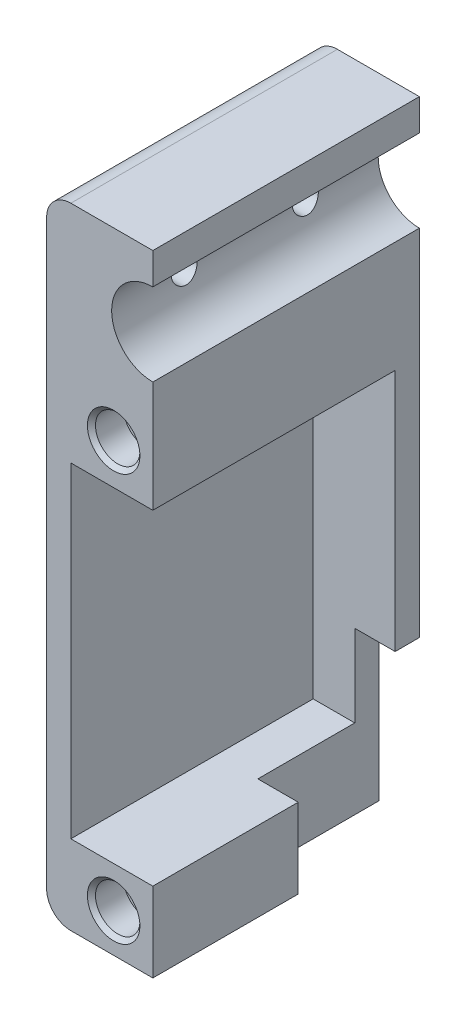
ISO-10303-21;
HEADER;
FILE_DESCRIPTION(('STEP AP214'),'2;1');
FILE_NAME('part.step','',(''),(''),'','','');
FILE_SCHEMA(('AUTOMOTIVE_DESIGN { 1 0 10303 214 1 1 1 1 }'));
ENDSEC;
DATA;
#1=APPLICATION_CONTEXT('core data for automotive mechanical design processes');
#2=APPLICATION_PROTOCOL_DEFINITION('international standard','automotive_design',2000,#1);
#3=PRODUCT_CONTEXT('',#1,'mechanical');
#4=PRODUCT('Part','Part','',(#3));
#5=PRODUCT_RELATED_PRODUCT_CATEGORY('part','',(#4));
#6=PRODUCT_DEFINITION_FORMATION('','',#4);
#7=PRODUCT_DEFINITION_CONTEXT('part definition',#1,'design');
#8=PRODUCT_DEFINITION('design','',#6,#7);
#9=PRODUCT_DEFINITION_SHAPE('','',#8);
#10=(LENGTH_UNIT() NAMED_UNIT(*) SI_UNIT(.MILLI.,.METRE.));
#11=(NAMED_UNIT(*) PLANE_ANGLE_UNIT() SI_UNIT($,.RADIAN.));
#12=(NAMED_UNIT(*) SI_UNIT($,.STERADIAN.) SOLID_ANGLE_UNIT());
#13=UNCERTAINTY_MEASURE_WITH_UNIT(LENGTH_MEASURE(1.E-05),#10,'distance_accuracy_value','');
#14=(GEOMETRIC_REPRESENTATION_CONTEXT(3) GLOBAL_UNCERTAINTY_ASSIGNED_CONTEXT((#13)) GLOBAL_UNIT_ASSIGNED_CONTEXT((#10,
#11,#12)) REPRESENTATION_CONTEXT('',''));
#15=CARTESIAN_POINT('',(0.,0.,0.));
#16=DIRECTION('',(0.,0.,1.));
#17=DIRECTION('',(1.,0.,0.));
#18=AXIS2_PLACEMENT_3D('',#15,#16,#17);
#19=CARTESIAN_POINT('',(-13.15,-30.,-30.));
#20=DIRECTION('',(0.,-1.,0.));
#21=DIRECTION('',(0.,0.,-1.));
#22=AXIS2_PLACEMENT_3D('',#19,#20,#21);
#23=PLANE('',#22);
#24=DIRECTION('',(0.,0.,-1.));
#25=VECTOR('',#24,1.);
#26=CARTESIAN_POINT('',(0.,-30.,-30.));
#27=LINE('',#26,#25);
#28=CARTESIAN_POINT('',(0.,-30.,0.));
#29=VERTEX_POINT('',#28);
#30=CARTESIAN_POINT('',(0.,-30.,-18.));
#31=VERTEX_POINT('',#30);
#32=EDGE_CURVE('E70',#29,#31,#27,.T.);
#33=ORIENTED_EDGE('',*,*,#32,.F.);
#34=DIRECTION('',(1.,0.,0.));
#35=VECTOR('',#34,1.);
#36=CARTESIAN_POINT('',(-13.15,-30.,0.));
#37=LINE('',#36,#35);
#38=CARTESIAN_POINT('',(-10.15,-30.,0.));
#39=VERTEX_POINT('',#38);
#40=EDGE_CURVE('E267',#39,#29,#37,.T.);
#41=ORIENTED_EDGE('',*,*,#40,.F.);
#42=DIRECTION('',(0.,0.,1.));
#43=VECTOR('',#42,1.);
#44=CARTESIAN_POINT('',(-10.15,-30.,-30.));
#45=LINE('',#44,#43);
#46=CARTESIAN_POINT('',(-10.15,-30.,-33.));
#47=VERTEX_POINT('',#46);
#48=EDGE_CURVE('E358',#39,#47,#45,.F.);
#49=ORIENTED_EDGE('',*,*,#48,.T.);
#50=DIRECTION('',(1.,0.,0.));
#51=VECTOR('',#50,1.);
#52=CARTESIAN_POINT('',(0.,-30.,-33.));
#53=LINE('',#52,#51);
#54=CARTESIAN_POINT('',(-5.,-30.,-33.));
#55=VERTEX_POINT('',#54);
#56=EDGE_CURVE('E225',#47,#55,#53,.T.);
#57=ORIENTED_EDGE('',*,*,#56,.T.);
#58=DIRECTION('',(0.,0.,-1.));
#59=VECTOR('',#58,1.);
#60=CARTESIAN_POINT('',(-5.,-30.,-33.));
#61=LINE('',#60,#59);
#62=CARTESIAN_POINT('',(-5.,-30.,-18.));
#63=VERTEX_POINT('',#62);
#64=EDGE_CURVE('E194',#63,#55,#61,.T.);
#65=ORIENTED_EDGE('',*,*,#64,.F.);
#66=DIRECTION('',(-1.,0.,0.));
#67=VECTOR('',#66,1.);
#68=CARTESIAN_POINT('',(-5.,-30.,-18.));
#69=LINE('',#68,#67);
#70=EDGE_CURVE('E190',#31,#63,#69,.T.);
#71=ORIENTED_EDGE('',*,*,#70,.F.);
#72=EDGE_LOOP('',(#33,#41,#49,#57,#65,#71));
#73=FACE_BOUND('',#72,.T.);
#74=ADVANCED_FACE('F45',(#73),#23,.T.);
#75=CARTESIAN_POINT('',(-13.15,30.,-30.));
#76=DIRECTION('',(-1.,0.,0.));
#77=DIRECTION('',(0.,0.,1.));
#78=AXIS2_PLACEMENT_3D('',#75,#76,#77);
#79=PLANE('',#78);
#80=CARTESIAN_POINT('',(-13.15,39.,-9.));
#81=DIRECTION('',(1.,0.,0.));
#82=DIRECTION('',(0.,0.,-1.));
#83=AXIS2_PLACEMENT_3D('',#80,#81,#82);
#84=CIRCLE('',#83,1.6);
#85=CARTESIAN_POINT('',(-13.15,39.,-10.6));
#86=VERTEX_POINT('',#85);
#87=EDGE_CURVE('E284',#86,#86,#84,.T.);
#88=ORIENTED_EDGE('',*,*,#87,.T.);
#89=EDGE_LOOP('',(#88));
#90=FACE_BOUND('',#89,.T.);
#91=CARTESIAN_POINT('',(-13.15,39.,-24.));
#92=DIRECTION('',(1.,0.,0.));
#93=DIRECTION('',(0.,0.,-1.));
#94=AXIS2_PLACEMENT_3D('',#91,#92,#93);
#95=CIRCLE('',#94,1.6);
#96=CARTESIAN_POINT('',(-13.15,39.,-25.6));
#97=VERTEX_POINT('',#96);
#98=EDGE_CURVE('E389',#97,#97,#95,.T.);
#99=ORIENTED_EDGE('',*,*,#98,.T.);
#100=EDGE_LOOP('',(#99));
#101=FACE_BOUND('',#100,.T.);
#102=DIRECTION('',(0.,-1.,0.));
#103=VECTOR('',#102,1.);
#104=CARTESIAN_POINT('',(-13.15,30.,0.));
#105=LINE('',#104,#103);
#106=CARTESIAN_POINT('',(-13.15,45.,0.));
#107=VERTEX_POINT('',#106);
#108=CARTESIAN_POINT('',(-13.15,-27.,0.));
#109=VERTEX_POINT('',#108);
#110=EDGE_CURVE('E260',#107,#109,#105,.T.);
#111=ORIENTED_EDGE('',*,*,#110,.F.);
#112=DIRECTION('',(0.,0.,1.));
#113=VECTOR('',#112,1.);
#114=CARTESIAN_POINT('',(-13.15,45.,-30.));
#115=LINE('',#114,#113);
#116=CARTESIAN_POINT('',(-13.15,45.,-33.));
#117=VERTEX_POINT('',#116);
#118=EDGE_CURVE('E472',#107,#117,#115,.F.);
#119=ORIENTED_EDGE('',*,*,#118,.T.);
#120=DIRECTION('',(0.,-1.,0.));
#121=VECTOR('',#120,1.);
#122=CARTESIAN_POINT('',(-13.15,0.,-33.));
#123=LINE('',#122,#121);
#124=CARTESIAN_POINT('',(-13.15,-27.,-33.));
#125=VERTEX_POINT('',#124);
#126=EDGE_CURVE('E230',#117,#125,#123,.T.);
#127=ORIENTED_EDGE('',*,*,#126,.T.);
#128=DIRECTION('',(0.,0.,1.));
#129=VECTOR('',#128,1.);
#130=CARTESIAN_POINT('',(-13.15,-27.,-30.));
#131=LINE('',#130,#129);
#132=EDGE_CURVE('E470',#125,#109,#131,.T.);
#133=ORIENTED_EDGE('',*,*,#132,.T.);
#134=EDGE_LOOP('',(#111,#119,#127,#133));
#135=FACE_BOUND('',#134,.T.);
#136=ADVANCED_FACE('F313',(#90,#101,#135),#79,.T.);
#137=CARTESIAN_POINT('',(0.,0.,0.));
#138=DIRECTION('',(0.,0.,1.));
#139=DIRECTION('',(1.,0.,0.));
#140=AXIS2_PLACEMENT_3D('',#137,#138,#139);
#141=PLANE('',#140);
#142=DIRECTION('',(0.,-1.,0.));
#143=VECTOR('',#142,1.);
#144=CARTESIAN_POINT('',(0.,0.,0.));
#145=LINE('',#144,#143);
#146=CARTESIAN_POINT('',(0.,48.,0.));
#147=VERTEX_POINT('',#146);
#148=CARTESIAN_POINT('',(0.,44.1,0.));
#149=VERTEX_POINT('',#148);
#150=EDGE_CURVE('E62',#147,#149,#145,.T.);
#151=ORIENTED_EDGE('',*,*,#150,.F.);
#152=DIRECTION('',(-1.,0.,0.));
#153=VECTOR('',#152,1.);
#154=CARTESIAN_POINT('',(-13.15,48.,0.));
#155=LINE('',#154,#153);
#156=CARTESIAN_POINT('',(-10.15,48.,0.));
#157=VERTEX_POINT('',#156);
#158=EDGE_CURVE('E218',#147,#157,#155,.T.);
#159=ORIENTED_EDGE('',*,*,#158,.T.);
#160=CARTESIAN_POINT('',(-10.15,45.,0.));
#161=DIRECTION('',(0.,0.,1.));
#162=DIRECTION('',(1.,0.,0.));
#163=AXIS2_PLACEMENT_3D('',#160,#161,#162);
#164=CIRCLE('',#163,3.);
#165=EDGE_CURVE('E481',#157,#107,#164,.T.);
#166=ORIENTED_EDGE('',*,*,#165,.T.);
#167=ORIENTED_EDGE('',*,*,#110,.T.);
#168=CARTESIAN_POINT('',(-10.15,-27.,0.));
#169=DIRECTION('',(0.,0.,1.));
#170=DIRECTION('',(1.,0.,0.));
#171=AXIS2_PLACEMENT_3D('',#168,#169,#170);
#172=CIRCLE('',#171,3.);
#173=EDGE_CURVE('E484',#109,#39,#172,.T.);
#174=ORIENTED_EDGE('',*,*,#173,.T.);
#175=ORIENTED_EDGE('',*,*,#40,.T.);
#176=CARTESIAN_POINT('',(0.,-20.15,0.));
#177=VERTEX_POINT('',#176);
#178=EDGE_CURVE('E422',#177,#29,#145,.T.);
#179=ORIENTED_EDGE('',*,*,#178,.F.);
#180=DIRECTION('',(1.,0.,0.));
#181=VECTOR('',#180,1.);
#182=CARTESIAN_POINT('',(-10.15,-20.15,0.));
#183=LINE('',#182,#181);
#184=CARTESIAN_POINT('',(-10.15,-20.15,0.));
#185=VERTEX_POINT('',#184);
#186=EDGE_CURVE('E239',#185,#177,#183,.T.);
#187=ORIENTED_EDGE('',*,*,#186,.F.);
#188=DIRECTION('',(0.,-1.,0.));
#189=VECTOR('',#188,1.);
#190=CARTESIAN_POINT('',(-10.15,20.15,0.));
#191=LINE('',#190,#189);
#192=CARTESIAN_POINT('',(-10.15,20.15,0.));
#193=VERTEX_POINT('',#192);
#194=EDGE_CURVE('E250',#193,#185,#191,.T.);
#195=ORIENTED_EDGE('',*,*,#194,.F.);
#196=DIRECTION('',(-1.,0.,0.));
#197=VECTOR('',#196,1.);
#198=CARTESIAN_POINT('',(-10.15,20.15,0.));
#199=LINE('',#198,#197);
#200=CARTESIAN_POINT('',(0.,20.15,0.));
#201=VERTEX_POINT('',#200);
#202=EDGE_CURVE('E234',#201,#193,#199,.T.);
#203=ORIENTED_EDGE('',*,*,#202,.F.);
#204=CARTESIAN_POINT('',(0.,33.9,0.));
#205=VERTEX_POINT('',#204);
#206=EDGE_CURVE('E416',#205,#201,#145,.T.);
#207=ORIENTED_EDGE('',*,*,#206,.F.);
#208=CARTESIAN_POINT('',(0.,39.,0.));
#209=DIRECTION('',(0.,0.,1.));
#210=DIRECTION('',(1.,0.,0.));
#211=AXIS2_PLACEMENT_3D('',#208,#209,#210);
#212=CIRCLE('',#211,5.1);
#213=EDGE_CURVE('E215',#149,#205,#212,.T.);
#214=ORIENTED_EDGE('',*,*,#213,.F.);
#215=EDGE_LOOP('',(#151,#159,#166,#167,#174,#175,#179,#187,#195,#203,#207,#214));
#216=FACE_BOUND('',#215,.T.);
#217=CARTESIAN_POINT('',(-4.85000000000001,25.2,0.));
#218=DIRECTION('',(0.,0.,1.));
#219=DIRECTION('',(1.,0.,0.));
#220=AXIS2_PLACEMENT_3D('',#217,#218,#219);
#221=CIRCLE('',#220,3.25000000000003);
#222=CARTESIAN_POINT('',(-1.59999999999998,25.2,0.));
#223=VERTEX_POINT('',#222);
#224=EDGE_CURVE('E351',#223,#223,#221,.F.);
#225=ORIENTED_EDGE('',*,*,#224,.T.);
#226=EDGE_LOOP('',(#225));
#227=FACE_BOUND('',#226,.T.);
#228=CARTESIAN_POINT('',(-4.85,-25.2,0.));
#229=DIRECTION('',(0.,0.,1.));
#230=DIRECTION('',(1.,0.,0.));
#231=AXIS2_PLACEMENT_3D('',#228,#229,#230);
#232=CIRCLE('',#231,3.25);
#233=CARTESIAN_POINT('',(-1.6,-25.2,0.));
#234=VERTEX_POINT('',#233);
#235=EDGE_CURVE('E357',#234,#234,#232,.F.);
#236=ORIENTED_EDGE('',*,*,#235,.T.);
#237=EDGE_LOOP('',(#236));
#238=FACE_BOUND('',#237,.T.);
#239=ADVANCED_FACE('F319',(#216,#227,#238),#141,.T.);
#240=CARTESIAN_POINT('',(-10.15,-20.15,-30.));
#241=DIRECTION('',(0.,-1.,0.));
#242=DIRECTION('',(0.,0.,-1.));
#243=AXIS2_PLACEMENT_3D('',#240,#241,#242);
#244=PLANE('',#243);
#245=ORIENTED_EDGE('',*,*,#186,.T.);
#246=DIRECTION('',(0.,0.,-1.));
#247=VECTOR('',#246,1.);
#248=CARTESIAN_POINT('',(0.,-20.15,-30.));
#249=LINE('',#248,#247);
#250=CARTESIAN_POINT('',(0.,-20.15,-18.));
#251=VERTEX_POINT('',#250);
#252=EDGE_CURVE('E430',#177,#251,#249,.T.);
#253=ORIENTED_EDGE('',*,*,#252,.T.);
#254=DIRECTION('',(-1.,0.,0.));
#255=VECTOR('',#254,1.);
#256=CARTESIAN_POINT('',(-10.15,-20.15,-18.));
#257=LINE('',#256,#255);
#258=CARTESIAN_POINT('',(-5.,-20.15,-18.));
#259=VERTEX_POINT('',#258);
#260=EDGE_CURVE('E271',#251,#259,#257,.T.);
#261=ORIENTED_EDGE('',*,*,#260,.T.);
#262=DIRECTION('',(0.,0.,-1.));
#263=VECTOR('',#262,1.);
#264=CARTESIAN_POINT('',(-5.,-20.15,-30.));
#265=LINE('',#264,#263);
#266=CARTESIAN_POINT('',(-5.,-20.15,-30.));
#267=VERTEX_POINT('',#266);
#268=EDGE_CURVE('E211',#259,#267,#265,.T.);
#269=ORIENTED_EDGE('',*,*,#268,.T.);
#270=DIRECTION('',(1.,0.,0.));
#271=VECTOR('',#270,1.);
#272=CARTESIAN_POINT('',(-10.15,-20.15,-30.));
#273=LINE('',#272,#271);
#274=CARTESIAN_POINT('',(-10.15,-20.15,-30.));
#275=VERTEX_POINT('',#274);
#276=EDGE_CURVE('E243',#275,#267,#273,.T.);
#277=ORIENTED_EDGE('',*,*,#276,.F.);
#278=DIRECTION('',(0.,0.,1.));
#279=VECTOR('',#278,1.);
#280=CARTESIAN_POINT('',(-10.15,-20.15,-30.));
#281=LINE('',#280,#279);
#282=EDGE_CURVE('E257',#275,#185,#281,.T.);
#283=ORIENTED_EDGE('',*,*,#282,.T.);
#284=EDGE_LOOP('',(#245,#253,#261,#269,#277,#283));
#285=FACE_BOUND('',#284,.T.);
#286=ADVANCED_FACE('F457',(#285),#244,.F.);
#287=CARTESIAN_POINT('',(-10.15,20.15,-30.));
#288=DIRECTION('',(-1.,0.,0.));
#289=DIRECTION('',(0.,-1.,0.));
#290=AXIS2_PLACEMENT_3D('',#287,#288,#289);
#291=PLANE('',#290);
#292=ORIENTED_EDGE('',*,*,#194,.T.);
#293=ORIENTED_EDGE('',*,*,#282,.F.);
#294=DIRECTION('',(0.,-1.,0.));
#295=VECTOR('',#294,1.);
#296=CARTESIAN_POINT('',(-10.15,20.15,-30.));
#297=LINE('',#296,#295);
#298=CARTESIAN_POINT('',(-10.15,20.15,-30.));
#299=VERTEX_POINT('',#298);
#300=EDGE_CURVE('E238',#299,#275,#297,.T.);
#301=ORIENTED_EDGE('',*,*,#300,.F.);
#302=DIRECTION('',(0.,0.,1.));
#303=VECTOR('',#302,1.);
#304=CARTESIAN_POINT('',(-10.15,20.15,-30.));
#305=LINE('',#304,#303);
#306=EDGE_CURVE('E247',#299,#193,#305,.T.);
#307=ORIENTED_EDGE('',*,*,#306,.T.);
#308=EDGE_LOOP('',(#292,#293,#301,#307));
#309=FACE_BOUND('',#308,.T.);
#310=ADVANCED_FACE('F454',(#309),#291,.F.);
#311=CARTESIAN_POINT('',(-10.15,20.15,-30.));
#312=DIRECTION('',(0.,1.,0.));
#313=DIRECTION('',(0.,0.,1.));
#314=AXIS2_PLACEMENT_3D('',#311,#312,#313);
#315=PLANE('',#314);
#316=DIRECTION('',(-1.,0.,0.));
#317=VECTOR('',#316,1.);
#318=CARTESIAN_POINT('',(-10.15,20.15,-30.));
#319=LINE('',#318,#317);
#320=CARTESIAN_POINT('',(0.,20.15,-30.));
#321=VERTEX_POINT('',#320);
#322=EDGE_CURVE('E235',#321,#299,#319,.T.);
#323=ORIENTED_EDGE('',*,*,#322,.F.);
#324=DIRECTION('',(0.,0.,1.));
#325=VECTOR('',#324,1.);
#326=CARTESIAN_POINT('',(0.,20.15,-30.));
#327=LINE('',#326,#325);
#328=EDGE_CURVE('E420',#321,#201,#327,.T.);
#329=ORIENTED_EDGE('',*,*,#328,.T.);
#330=ORIENTED_EDGE('',*,*,#202,.T.);
#331=ORIENTED_EDGE('',*,*,#306,.F.);
#332=EDGE_LOOP('',(#323,#329,#330,#331));
#333=FACE_BOUND('',#332,.T.);
#334=ADVANCED_FACE('F452',(#333),#315,.F.);
#335=CARTESIAN_POINT('',(0.,0.,-30.));
#336=DIRECTION('',(0.,0.,-1.));
#337=DIRECTION('',(-1.,0.,0.));
#338=AXIS2_PLACEMENT_3D('',#335,#336,#337);
#339=PLANE('',#338);
#340=DIRECTION('',(1.,0.,0.));
#341=VECTOR('',#340,1.);
#342=CARTESIAN_POINT('',(0.,-10.,-30.));
#343=LINE('',#342,#341);
#344=CARTESIAN_POINT('',(-5.,-10.,-30.));
#345=VERTEX_POINT('',#344);
#346=CARTESIAN_POINT('',(0.,-10.,-30.));
#347=VERTEX_POINT('',#346);
#348=EDGE_CURVE('E203',#345,#347,#343,.T.);
#349=ORIENTED_EDGE('',*,*,#348,.T.);
#350=DIRECTION('',(0.,1.,0.));
#351=VECTOR('',#350,1.);
#352=CARTESIAN_POINT('',(0.,0.,-30.));
#353=LINE('',#352,#351);
#354=EDGE_CURVE('E163',#347,#321,#353,.T.);
#355=ORIENTED_EDGE('',*,*,#354,.T.);
#356=ORIENTED_EDGE('',*,*,#322,.T.);
#357=ORIENTED_EDGE('',*,*,#300,.T.);
#358=ORIENTED_EDGE('',*,*,#276,.T.);
#359=DIRECTION('',(0.,1.,0.));
#360=VECTOR('',#359,1.);
#361=CARTESIAN_POINT('',(-5.,0.,-30.));
#362=LINE('',#361,#360);
#363=EDGE_CURVE('E207',#267,#345,#362,.T.);
#364=ORIENTED_EDGE('',*,*,#363,.T.);
#365=EDGE_LOOP('',(#349,#355,#356,#357,#358,#364));
#366=FACE_BOUND('',#365,.T.);
#367=ADVANCED_FACE('F448',(#366),#339,.F.);
#368=CARTESIAN_POINT('',(0.,0.,-33.));
#369=DIRECTION('',(0.,0.,-1.));
#370=DIRECTION('',(-1.,0.,0.));
#371=AXIS2_PLACEMENT_3D('',#368,#369,#370);
#372=PLANE('',#371);
#373=DIRECTION('',(0.,1.,0.));
#374=VECTOR('',#373,1.);
#375=CARTESIAN_POINT('',(0.,0.,-33.));
#376=LINE('',#375,#374);
#377=CARTESIAN_POINT('',(0.,-10.,-33.));
#378=VERTEX_POINT('',#377);
#379=CARTESIAN_POINT('',(0.,33.9,-33.));
#380=VERTEX_POINT('',#379);
#381=EDGE_CURVE('E160',#378,#380,#376,.T.);
#382=ORIENTED_EDGE('',*,*,#381,.F.);
#383=DIRECTION('',(1.,0.,0.));
#384=VECTOR('',#383,1.);
#385=CARTESIAN_POINT('',(-5.,-10.,-33.));
#386=LINE('',#385,#384);
#387=CARTESIAN_POINT('',(-5.,-10.,-33.));
#388=VERTEX_POINT('',#387);
#389=EDGE_CURVE('E172',#388,#378,#386,.T.);
#390=ORIENTED_EDGE('',*,*,#389,.F.);
#391=DIRECTION('',(0.,-1.,0.));
#392=VECTOR('',#391,1.);
#393=CARTESIAN_POINT('',(-5.,-10.,-33.));
#394=LINE('',#393,#392);
#395=EDGE_CURVE('E184',#388,#55,#394,.T.);
#396=ORIENTED_EDGE('',*,*,#395,.T.);
#397=ORIENTED_EDGE('',*,*,#56,.F.);
#398=CARTESIAN_POINT('',(-10.15,-27.,-33.));
#399=DIRECTION('',(0.,0.,-1.));
#400=DIRECTION('',(-1.,0.,0.));
#401=AXIS2_PLACEMENT_3D('',#398,#399,#400);
#402=CIRCLE('',#401,3.);
#403=EDGE_CURVE('E467',#47,#125,#402,.T.);
#404=ORIENTED_EDGE('',*,*,#403,.T.);
#405=ORIENTED_EDGE('',*,*,#126,.F.);
#406=CARTESIAN_POINT('',(-10.15,45.,-33.));
#407=DIRECTION('',(0.,0.,-1.));
#408=DIRECTION('',(-1.,0.,0.));
#409=AXIS2_PLACEMENT_3D('',#406,#407,#408);
#410=CIRCLE('',#409,3.);
#411=CARTESIAN_POINT('',(-10.15,48.,-33.));
#412=VERTEX_POINT('',#411);
#413=EDGE_CURVE('E364',#117,#412,#410,.T.);
#414=ORIENTED_EDGE('',*,*,#413,.T.);
#415=DIRECTION('',(-1.,0.,0.));
#416=VECTOR('',#415,1.);
#417=CARTESIAN_POINT('',(-13.15,48.,-33.));
#418=LINE('',#417,#416);
#419=CARTESIAN_POINT('',(0.,48.,-33.));
#420=VERTEX_POINT('',#419);
#421=EDGE_CURVE('E222',#420,#412,#418,.T.);
#422=ORIENTED_EDGE('',*,*,#421,.F.);
#423=CARTESIAN_POINT('',(0.,44.1,-33.));
#424=VERTEX_POINT('',#423);
#425=EDGE_CURVE('E178',#424,#420,#376,.T.);
#426=ORIENTED_EDGE('',*,*,#425,.F.);
#427=CARTESIAN_POINT('',(0.,39.,-33.));
#428=DIRECTION('',(0.,0.,1.));
#429=DIRECTION('',(1.,0.,0.));
#430=AXIS2_PLACEMENT_3D('',#427,#428,#429);
#431=CIRCLE('',#430,5.1);
#432=EDGE_CURVE('E175',#424,#380,#431,.T.);
#433=ORIENTED_EDGE('',*,*,#432,.T.);
#434=EDGE_LOOP('',(#382,#390,#396,#397,#404,#405,#414,#422,#426,#433));
#435=FACE_BOUND('',#434,.T.);
#436=ADVANCED_FACE('F170',(#435),#372,.T.);
#437=CARTESIAN_POINT('',(-13.15,48.,-33.));
#438=DIRECTION('',(0.,1.,0.));
#439=DIRECTION('',(0.,0.,1.));
#440=AXIS2_PLACEMENT_3D('',#437,#438,#439);
#441=PLANE('',#440);
#442=DIRECTION('',(0.,0.,1.));
#443=VECTOR('',#442,1.);
#444=CARTESIAN_POINT('',(0.,48.,-33.));
#445=LINE('',#444,#443);
#446=EDGE_CURVE('E384',#420,#147,#445,.T.);
#447=ORIENTED_EDGE('',*,*,#446,.F.);
#448=ORIENTED_EDGE('',*,*,#421,.T.);
#449=DIRECTION('',(0.,0.,1.));
#450=VECTOR('',#449,1.);
#451=CARTESIAN_POINT('',(-10.15,48.,-33.));
#452=LINE('',#451,#450);
#453=EDGE_CURVE('E274',#412,#157,#452,.T.);
#454=ORIENTED_EDGE('',*,*,#453,.T.);
#455=ORIENTED_EDGE('',*,*,#158,.F.);
#456=EDGE_LOOP('',(#447,#448,#454,#455));
#457=FACE_BOUND('',#456,.T.);
#458=ADVANCED_FACE('F406',(#457),#441,.T.);
#459=CARTESIAN_POINT('',(0.,39.,-33.));
#460=DIRECTION('',(0.,0.,1.));
#461=DIRECTION('',(1.,0.,0.));
#462=AXIS2_PLACEMENT_3D('',#459,#460,#461);
#463=CYLINDRICAL_SURFACE('',#462,5.1);
#464=CARTESIAN_POINT('',(-5.1,39.,-10.6));
#465=CARTESIAN_POINT('',(-5.0999995978654,38.9124150710374,-10.5999994802216));
#466=CARTESIAN_POINT('',(-5.09772251940103,38.8248246285897,-10.5927846439487));
#467=CARTESIAN_POINT('',(-5.08886196072231,38.6522063156821,-10.5641922910852));
#468=CARTESIAN_POINT('',(-5.08227753643756,38.5671790112776,-10.5428116696696));
#469=CARTESIAN_POINT('',(-5.06552136722495,38.402201074425,-10.4866804666817));
#470=CARTESIAN_POINT('',(-5.05535520277525,38.3222427716609,-10.451950675974));
#471=CARTESIAN_POINT('',(-5.03248453144178,38.1692846565063,-10.3701957591501));
#472=CARTESIAN_POINT('',(-5.01977961860755,38.0962859597303,-10.3231686663014));
#473=CARTESIAN_POINT('',(-4.99273742590603,37.9570485429709,-10.2166146522947));
#474=CARTESIAN_POINT('',(-4.97836437546228,37.891056627399,-10.156774337796));
#475=CARTESIAN_POINT('',(-4.94981242435394,37.7698611947318,-10.0269597499417));
#476=CARTESIAN_POINT('',(-4.93563356065964,37.7146597061365,-9.9569835754351));
#477=CARTESIAN_POINT('',(-4.90869098282997,37.6152698299224,-9.80674216394914));
#478=CARTESIAN_POINT('',(-4.89597138661822,37.5713904756317,-9.72626382784306));
#479=CARTESIAN_POINT('',(-4.87392584746738,37.49789151631,-9.55860657817028));
#480=CARTESIAN_POINT('',(-4.86459900273855,37.4682681213831,-9.4714294526076));
#481=CARTESIAN_POINT('',(-4.85076929109205,37.4250263752338,-9.29563555557701));
#482=CARTESIAN_POINT('',(-4.84612871895365,37.4109499292096,-9.20714260222541));
#483=CARTESIAN_POINT('',(-4.84178820864405,37.3977704525846,-9.0289387415049));
#484=CARTESIAN_POINT('',(-4.84208694514176,37.3986634053478,-8.93922816730706));
#485=CARTESIAN_POINT('',(-4.84746979753739,37.4150392365445,-8.76493157706852));
#486=CARTESIAN_POINT('',(-4.85236261745577,37.4299389097491,-8.68028386216606));
#487=CARTESIAN_POINT('',(-4.86607144465008,37.4729593164895,-8.51475613668445));
#488=CARTESIAN_POINT('',(-4.87488787185897,37.5010814652089,-8.43387653041947));
#489=CARTESIAN_POINT('',(-4.89559653956698,37.5701586559405,-8.27679527353215));
#490=CARTESIAN_POINT('',(-4.90753208146203,37.6112962308191,-8.20067984629833));
#491=CARTESIAN_POINT('',(-4.93311440241933,37.7051097653529,-8.05624149089502));
#492=CARTESIAN_POINT('',(-4.94676162853342,37.7577887420461,-7.98792060741243));
#493=CARTESIAN_POINT('',(-4.97499619869171,37.8760480460705,-7.85771474215367));
#494=CARTESIAN_POINT('',(-4.98959794181449,37.9421095665259,-7.7962691164063));
#495=CARTESIAN_POINT('',(-5.01754407576464,38.0837808520876,-7.68522113362022));
#496=CARTESIAN_POINT('',(-5.03088837192675,38.1593913350741,-7.63561966782313));
#497=CARTESIAN_POINT('',(-5.05495809548407,38.3188658164087,-7.54936715985681));
#498=CARTESIAN_POINT('',(-5.06566197502492,38.4027903634615,-7.51282164772449));
#499=CARTESIAN_POINT('',(-5.08308923850604,38.5760099421774,-7.45449782377032));
#500=CARTESIAN_POINT('',(-5.08981384091657,38.6653033206481,-7.43271499126096));
#501=CARTESIAN_POINT('',(-5.09832847100694,38.8429970532464,-7.4052849960251));
#502=CARTESIAN_POINT('',(-5.10030027826555,38.9312970258974,-7.39904311657419));
#503=CARTESIAN_POINT('',(-5.09962520233436,39.1076926040331,-7.40119442201035));
#504=CARTESIAN_POINT('',(-5.09697899973946,39.195788237717,-7.40958545032272));
#505=CARTESIAN_POINT('',(-5.08748471685397,39.3669755760307,-7.44028731722819));
#506=CARTESIAN_POINT('',(-5.0807437222544,39.4501373716221,-7.46224364285191));
#507=CARTESIAN_POINT('',(-5.06384948080064,39.6115729216896,-7.51901965883127));
#508=CARTESIAN_POINT('',(-5.05369581155532,39.6898460696688,-7.55384094155221));
#509=CARTESIAN_POINT('',(-5.03071005413655,39.8414155109311,-7.63631166391579));
#510=CARTESIAN_POINT('',(-5.01781844303764,39.9145429023563,-7.68425447357774));
#511=CARTESIAN_POINT('',(-4.99083023982398,40.0519136946902,-7.79125578508335));
#512=CARTESIAN_POINT('',(-4.97673331904261,40.1161546598462,-7.85031732411792));
#513=CARTESIAN_POINT('',(-4.94821406589,40.2365938854157,-7.98067686761574));
#514=CARTESIAN_POINT('',(-4.93380123722311,40.292368225885,-8.05236950508746));
#515=CARTESIAN_POINT('',(-4.90687043006833,40.3911334300512,-8.20440966477264));
#516=CARTESIAN_POINT('',(-4.89435242370656,40.4341244818064,-8.28475705964009));
#517=CARTESIAN_POINT('',(-4.87276671090339,40.5058387429039,-8.4516700764497));
#518=CARTESIAN_POINT('',(-4.86368598465003,40.534615920865,-8.53821072681312));
#519=CARTESIAN_POINT('',(-4.8500834353677,40.5770851648961,-8.7152530328405));
#520=CARTESIAN_POINT('',(-4.84555985996859,40.5907830296321,-8.80575315198321));
#521=CARTESIAN_POINT('',(-4.84176735878142,40.6022862889577,-8.98371098363634));
#522=CARTESIAN_POINT('',(-4.84226833403125,40.6007875740568,-9.07111936258359));
#523=CARTESIAN_POINT('',(-4.84790894442588,40.5836219963737,-9.2443734072558));
#524=CARTESIAN_POINT('',(-4.85304835998463,40.5679558042867,-9.33021914676062));
#525=CARTESIAN_POINT('',(-4.86722536082887,40.5233674013347,-9.49665592818197));
#526=CARTESIAN_POINT('',(-4.87620383075425,40.4946458161208,-9.57730613428645));
#527=CARTESIAN_POINT('',(-4.89703179566069,40.4249201436079,-9.73270707491687));
#528=CARTESIAN_POINT('',(-4.9088818778422,40.3839135438068,-9.80745659869427));
#529=CARTESIAN_POINT('',(-4.93470016507193,40.2888931536011,-9.95212162399598));
#530=CARTESIAN_POINT('',(-4.94873341327815,40.2344306630854,-10.0217307652892));
#531=CARTESIAN_POINT('',(-4.97703929232033,40.1148322412613,-10.1510471358657));
#532=CARTESIAN_POINT('',(-4.9913119864614,40.0496934461065,-10.210751699643));
#533=CARTESIAN_POINT('',(-5.01905369907435,39.9080051500874,-10.3205373997419));
#534=CARTESIAN_POINT('',(-5.03248064804565,39.8311500107385,-10.3702359039763));
#535=CARTESIAN_POINT('',(-5.05648777244719,39.6697551246144,-10.4559423954244));
#536=CARTESIAN_POINT('',(-5.06706904483565,39.5852183558332,-10.4919556602745));
#537=CARTESIAN_POINT('',(-5.08347383491128,39.4180416474033,-10.5467160736056));
#538=CARTESIAN_POINT('',(-5.08961706816,39.335817483443,-10.5666396274491));
#539=CARTESIAN_POINT('',(-5.09787993004197,39.1690636057391,-10.593280480265));
#540=CARTESIAN_POINT('',(-5.10000038812836,39.0845343709233,-10.6000005016746));
#541=CARTESIAN_POINT('',(-5.1,39.,-10.6));
#542=B_SPLINE_CURVE_WITH_KNOTS('',3,(#464,#465,#466,#467,#468,#469,#470,#471,#472,#473,#474,
#475,#476,#477,#478,#479,#480,#481,#482,#483,#484,#485,#486,#487,#488,#489,#490,#491,#492,#493,
#494,#495,#496,#497,#498,#499,#500,#501,#502,#503,#504,#505,#506,#507,#508,#509,#510,#511,#512,
#513,#514,#515,#516,#517,#518,#519,#520,#521,#522,#523,#524,#525,#526,#527,#528,#529,#530,#531,
#532,#533,#534,#535,#536,#537,#538,#539,#540,#541),.UNSPECIFIED.,.T.,.F.,(4,2,2,2,2,2,2,2,2,2,2,
2,2,2,2,2,2,2,2,2,2,2,2,2,2,2,2,2,2,2,2,2,2,2,2,2,2,2,4),(0.,0.262444045338474,
0.524945631612869,0.787040026678758,1.0491763646963,1.31865962530831,1.58819349765173,
1.86445015298867,2.14063332585338,2.40844156099327,2.67617793813782,2.93323810565555,
3.19032579223809,3.4511919451298,3.7121263725882,3.98503787547736,4.25796990776655,
4.53306060821549,4.80806703116749,5.07237568198895,5.33664538271351,5.59428487527849,
5.8519562679659,6.11594018463836,6.37999631603606,6.65460319632828,6.92920603660971,
7.20275806579887,7.47620486529464,7.73718852858925,7.99815983743714,8.25524965484558,
8.51239208758783,8.77966261299151,9.04700494959079,9.32317038569884,9.59922921180486,
9.85258465092105,10.1058878451807),.UNSPECIFIED.);
#543=CARTESIAN_POINT('',(-5.1,39.,-10.6));
#544=VERTEX_POINT('',#543);
#545=EDGE_CURVE('E198',#544,#544,#542,.T.);
#546=ORIENTED_EDGE('',*,*,#545,.T.);
#547=EDGE_LOOP('',(#546));
#548=FACE_BOUND('',#547,.T.);
#549=CARTESIAN_POINT('',(-5.1,39.,-25.6));
#550=CARTESIAN_POINT('',(-5.0999995978654,38.9124150710374,-25.5999994802216));
#551=CARTESIAN_POINT('',(-5.09772251940103,38.8248246285896,-25.5927846439487));
#552=CARTESIAN_POINT('',(-5.08886196072231,38.6522063156821,-25.5641922910852));
#553=CARTESIAN_POINT('',(-5.08227753643756,38.5671790112775,-25.5428116696696));
#554=CARTESIAN_POINT('',(-5.06552136722495,38.402201074425,-25.4866804666817));
#555=CARTESIAN_POINT('',(-5.05535520277525,38.3222427716609,-25.451950675974));
#556=CARTESIAN_POINT('',(-5.03248453144178,38.1692846565063,-25.3701957591501));
#557=CARTESIAN_POINT('',(-5.01977961860755,38.0962859597302,-25.3231686663014));
#558=CARTESIAN_POINT('',(-4.99273742590602,37.9570485429709,-25.2166146522947));
#559=CARTESIAN_POINT('',(-4.97836437546228,37.891056627399,-25.156774337796));
#560=CARTESIAN_POINT('',(-4.94981242435394,37.7698611947317,-25.0269597499417));
#561=CARTESIAN_POINT('',(-4.93563356065964,37.7146597061365,-24.9569835754351));
#562=CARTESIAN_POINT('',(-4.90869098282997,37.6152698299224,-24.8067421639491));
#563=CARTESIAN_POINT('',(-4.89597138661822,37.5713904756317,-24.7262638278431));
#564=CARTESIAN_POINT('',(-4.87392584746737,37.49789151631,-24.5586065781703));
#565=CARTESIAN_POINT('',(-4.86459900273855,37.4682681213831,-24.4714294526076));
#566=CARTESIAN_POINT('',(-4.85076929109205,37.4250263752338,-24.295635555577));
#567=CARTESIAN_POINT('',(-4.84612871895365,37.4109499292095,-24.2071426022254));
#568=CARTESIAN_POINT('',(-4.84178820864405,37.3977704525846,-24.0289387415049));
#569=CARTESIAN_POINT('',(-4.84208694514176,37.3986634053478,-23.9392281673071));
#570=CARTESIAN_POINT('',(-4.84746979753739,37.4150392365445,-23.7649315770685));
#571=CARTESIAN_POINT('',(-4.85236261745577,37.4299389097491,-23.6802838621661));
#572=CARTESIAN_POINT('',(-4.86607144465008,37.4729593164895,-23.5147561366844));
#573=CARTESIAN_POINT('',(-4.87488787185897,37.5010814652089,-23.4338765304195));
#574=CARTESIAN_POINT('',(-4.89559653956697,37.5701586559405,-23.2767952735322));
#575=CARTESIAN_POINT('',(-4.90753208146203,37.6112962308191,-23.2006798462983));
#576=CARTESIAN_POINT('',(-4.93311440241932,37.7051097653529,-23.056241490895));
#577=CARTESIAN_POINT('',(-4.94676162853342,37.7577887420461,-22.9879206074124));
#578=CARTESIAN_POINT('',(-4.97499619869171,37.8760480460705,-22.8577147421537));
#579=CARTESIAN_POINT('',(-4.98959794181449,37.9421095665259,-22.7962691164063));
#580=CARTESIAN_POINT('',(-5.01754407576464,38.0837808520876,-22.6852211336202));
#581=CARTESIAN_POINT('',(-5.03088837192675,38.1593913350741,-22.6356196678231));
#582=CARTESIAN_POINT('',(-5.05495809548407,38.3188658164087,-22.5493671598568));
#583=CARTESIAN_POINT('',(-5.06566197502492,38.4027903634615,-22.5128216477245));
#584=CARTESIAN_POINT('',(-5.08308923850604,38.5760099421774,-22.4544978237703));
#585=CARTESIAN_POINT('',(-5.08981384091657,38.6653033206481,-22.432714991261));
#586=CARTESIAN_POINT('',(-5.09832847100694,38.8429970532464,-22.4052849960251));
#587=CARTESIAN_POINT('',(-5.10030027826555,38.9312970258974,-22.3990431165742));
#588=CARTESIAN_POINT('',(-5.09962520233436,39.1076926040331,-22.4011944220103));
#589=CARTESIAN_POINT('',(-5.09697899973946,39.195788237717,-22.4095854503227));
#590=CARTESIAN_POINT('',(-5.08748471685397,39.3669755760307,-22.4402873172282));
#591=CARTESIAN_POINT('',(-5.0807437222544,39.4501373716221,-22.4622436428519));
#592=CARTESIAN_POINT('',(-5.06384948080064,39.6115729216896,-22.5190196588313));
#593=CARTESIAN_POINT('',(-5.05369581155532,39.6898460696688,-22.5538409415522));
#594=CARTESIAN_POINT('',(-5.03071005413655,39.8414155109311,-22.6363116639158));
#595=CARTESIAN_POINT('',(-5.01781844303764,39.9145429023563,-22.6842544735777));
#596=CARTESIAN_POINT('',(-4.99083023982398,40.0519136946902,-22.7912557850834));
#597=CARTESIAN_POINT('',(-4.97673331904261,40.1161546598462,-22.8503173241179));
#598=CARTESIAN_POINT('',(-4.94821406589,40.2365938854157,-22.9806768676157));
#599=CARTESIAN_POINT('',(-4.93380123722311,40.292368225885,-23.0523695050875));
#600=CARTESIAN_POINT('',(-4.90687043006834,40.3911334300512,-23.2044096647726));
#601=CARTESIAN_POINT('',(-4.89435242370656,40.4341244818064,-23.2847570596401));
#602=CARTESIAN_POINT('',(-4.87276671090339,40.5058387429039,-23.4516700764497));
#603=CARTESIAN_POINT('',(-4.86368598465003,40.534615920865,-23.5382107268131));
#604=CARTESIAN_POINT('',(-4.8500834353677,40.5770851648961,-23.7152530328405));
#605=CARTESIAN_POINT('',(-4.8455598599686,40.5907830296321,-23.8057531519832));
#606=CARTESIAN_POINT('',(-4.84176735878142,40.6022862889577,-23.9837109836363));
#607=CARTESIAN_POINT('',(-4.84226833403125,40.6007875740568,-24.0711193625836));
#608=CARTESIAN_POINT('',(-4.84790894442588,40.5836219963737,-24.2443734072558));
#609=CARTESIAN_POINT('',(-4.85304835998464,40.5679558042867,-24.3302191467606));
#610=CARTESIAN_POINT('',(-4.86722536082887,40.5233674013347,-24.496655928182));
#611=CARTESIAN_POINT('',(-4.87620383075426,40.4946458161208,-24.5773061342865));
#612=CARTESIAN_POINT('',(-4.89703179566069,40.4249201436079,-24.7327070749169));
#613=CARTESIAN_POINT('',(-4.90888187784221,40.3839135438068,-24.8074565986943));
#614=CARTESIAN_POINT('',(-4.93470016507193,40.2888931536011,-24.952121623996));
#615=CARTESIAN_POINT('',(-4.94873341327815,40.2344306630854,-25.0217307652892));
#616=CARTESIAN_POINT('',(-4.97703929232034,40.1148322412613,-25.1510471358657));
#617=CARTESIAN_POINT('',(-4.9913119864614,40.0496934461065,-25.210751699643));
#618=CARTESIAN_POINT('',(-5.01905369907435,39.9080051500873,-25.3205373997419));
#619=CARTESIAN_POINT('',(-5.03248064804565,39.8311500107385,-25.3702359039762));
#620=CARTESIAN_POINT('',(-5.05648777244719,39.6697551246144,-25.4559423954244));
#621=CARTESIAN_POINT('',(-5.06706904483565,39.5852183558331,-25.4919556602745));
#622=CARTESIAN_POINT('',(-5.08347383491128,39.4180416474033,-25.5467160736056));
#623=CARTESIAN_POINT('',(-5.08961706816,39.335817483443,-25.5666396274491));
#624=CARTESIAN_POINT('',(-5.09787993004197,39.1690636057391,-25.593280480265));
#625=CARTESIAN_POINT('',(-5.10000038812836,39.0845343709233,-25.6000005016746));
#626=CARTESIAN_POINT('',(-5.1,39.,-25.6));
#627=B_SPLINE_CURVE_WITH_KNOTS('',3,(#549,#550,#551,#552,#553,#554,#555,#556,#557,#558,#559,
#560,#561,#562,#563,#564,#565,#566,#567,#568,#569,#570,#571,#572,#573,#574,#575,#576,#577,#578,
#579,#580,#581,#582,#583,#584,#585,#586,#587,#588,#589,#590,#591,#592,#593,#594,#595,#596,#597,
#598,#599,#600,#601,#602,#603,#604,#605,#606,#607,#608,#609,#610,#611,#612,#613,#614,#615,#616,
#617,#618,#619,#620,#621,#622,#623,#624,#625,#626),.UNSPECIFIED.,.T.,.F.,(4,2,2,2,2,2,2,2,2,2,2,
2,2,2,2,2,2,2,2,2,2,2,2,2,2,2,2,2,2,2,2,2,2,2,2,2,2,2,4),(0.,0.262444045338481,
0.524945631612869,0.787040026678766,1.0491763646963,1.31865962530832,1.58819349765173,
1.86445015298867,2.14063332585338,2.40844156099327,2.67617793813782,2.93323810565555,
3.19032579223809,3.4511919451298,3.7121263725882,3.98503787547737,4.25796990776655,
4.53306060821549,4.80806703116749,5.07237568198896,5.33664538271352,5.59428487527849,
5.85195626796591,6.11594018463837,6.37999631603606,6.65460319632829,6.92920603660971,
7.20275806579887,7.47620486529464,7.73718852858925,7.99815983743714,8.25524965484558,
8.51239208758784,8.77966261299152,9.04700494959079,9.32317038569884,9.59922921180486,
9.85258465092104,10.1058878451807),.UNSPECIFIED.);
#628=CARTESIAN_POINT('',(-5.1,39.,-25.6));
#629=VERTEX_POINT('',#628);
#630=EDGE_CURVE('E275',#629,#629,#627,.T.);
#631=ORIENTED_EDGE('',*,*,#630,.T.);
#632=EDGE_LOOP('',(#631));
#633=FACE_BOUND('',#632,.T.);
#634=ORIENTED_EDGE('',*,*,#213,.T.);
#635=DIRECTION('',(0.,0.,1.));
#636=VECTOR('',#635,1.);
#637=CARTESIAN_POINT('',(0.,33.9,-33.));
#638=LINE('',#637,#636);
#639=EDGE_CURVE('E409',#205,#380,#638,.F.);
#640=ORIENTED_EDGE('',*,*,#639,.T.);
#641=ORIENTED_EDGE('',*,*,#432,.F.);
#642=DIRECTION('',(0.,0.,1.));
#643=VECTOR('',#642,1.);
#644=CARTESIAN_POINT('',(0.,44.1,-33.));
#645=LINE('',#644,#643);
#646=EDGE_CURVE('E410',#424,#149,#645,.T.);
#647=ORIENTED_EDGE('',*,*,#646,.T.);
#648=EDGE_LOOP('',(#634,#640,#641,#647));
#649=FACE_BOUND('',#648,.T.);
#650=ADVANCED_FACE('F290',(#548,#633,#649),#463,.F.);
#651=CARTESIAN_POINT('',(-5.,-10.,-18.));
#652=DIRECTION('',(0.,0.,1.));
#653=DIRECTION('',(1.,0.,0.));
#654=AXIS2_PLACEMENT_3D('',#651,#652,#653);
#655=PLANE('',#654);
#656=ORIENTED_EDGE('',*,*,#260,.F.);
#657=DIRECTION('',(0.,-1.,0.));
#658=VECTOR('',#657,1.);
#659=CARTESIAN_POINT('',(0.,-10.,-18.));
#660=LINE('',#659,#658);
#661=EDGE_CURVE('E425',#251,#31,#660,.T.);
#662=ORIENTED_EDGE('',*,*,#661,.T.);
#663=ORIENTED_EDGE('',*,*,#70,.T.);
#664=DIRECTION('',(0.,-1.,0.));
#665=VECTOR('',#664,1.);
#666=CARTESIAN_POINT('',(-5.,-10.,-18.));
#667=LINE('',#666,#665);
#668=EDGE_CURVE('E188',#259,#63,#667,.T.);
#669=ORIENTED_EDGE('',*,*,#668,.F.);
#670=EDGE_LOOP('',(#656,#662,#663,#669));
#671=FACE_BOUND('',#670,.T.);
#672=ADVANCED_FACE('F305',(#671),#655,.F.);
#673=CARTESIAN_POINT('',(-5.,-10.,-33.));
#674=DIRECTION('',(-1.,0.,0.));
#675=DIRECTION('',(0.,0.,1.));
#676=AXIS2_PLACEMENT_3D('',#673,#674,#675);
#677=PLANE('',#676);
#678=ORIENTED_EDGE('',*,*,#668,.T.);
#679=ORIENTED_EDGE('',*,*,#64,.T.);
#680=ORIENTED_EDGE('',*,*,#395,.F.);
#681=DIRECTION('',(0.,0.,-1.));
#682=VECTOR('',#681,1.);
#683=CARTESIAN_POINT('',(-5.,-10.,-33.));
#684=LINE('',#683,#682);
#685=EDGE_CURVE('E182',#345,#388,#684,.T.);
#686=ORIENTED_EDGE('',*,*,#685,.F.);
#687=ORIENTED_EDGE('',*,*,#363,.F.);
#688=ORIENTED_EDGE('',*,*,#268,.F.);
#689=EDGE_LOOP('',(#678,#679,#680,#686,#687,#688));
#690=FACE_BOUND('',#689,.T.);
#691=ADVANCED_FACE('F304',(#690),#677,.F.);
#692=CARTESIAN_POINT('',(0.,-10.,0.));
#693=DIRECTION('',(0.,1.,0.));
#694=DIRECTION('',(0.,0.,1.));
#695=AXIS2_PLACEMENT_3D('',#692,#693,#694);
#696=PLANE('',#695);
#697=ORIENTED_EDGE('',*,*,#389,.T.);
#698=DIRECTION('',(0.,0.,1.));
#699=VECTOR('',#698,1.);
#700=CARTESIAN_POINT('',(0.,-10.,0.));
#701=LINE('',#700,#699);
#702=EDGE_CURVE('E12',#378,#347,#701,.T.);
#703=ORIENTED_EDGE('',*,*,#702,.T.);
#704=ORIENTED_EDGE('',*,*,#348,.F.);
#705=ORIENTED_EDGE('',*,*,#685,.T.);
#706=EDGE_LOOP('',(#697,#703,#704,#705));
#707=FACE_BOUND('',#706,.T.);
#708=ADVANCED_FACE('F180',(#707),#696,.F.);
#709=CARTESIAN_POINT('',(-13.15,39.,-24.));
#710=DIRECTION('',(1.,0.,0.));
#711=DIRECTION('',(0.,0.,-1.));
#712=AXIS2_PLACEMENT_3D('',#709,#710,#711);
#713=CYLINDRICAL_SURFACE('',#712,1.6);
#714=ORIENTED_EDGE('',*,*,#98,.F.);
#715=EDGE_LOOP('',(#714));
#716=FACE_BOUND('',#715,.T.);
#717=ORIENTED_EDGE('',*,*,#630,.F.);
#718=EDGE_LOOP('',(#717));
#719=FACE_BOUND('',#718,.T.);
#720=ADVANCED_FACE('F294',(#716,#719),#713,.F.);
#721=CARTESIAN_POINT('',(-13.15,39.,-9.));
#722=DIRECTION('',(1.,0.,0.));
#723=DIRECTION('',(0.,0.,-1.));
#724=AXIS2_PLACEMENT_3D('',#721,#722,#723);
#725=CYLINDRICAL_SURFACE('',#724,1.6);
#726=ORIENTED_EDGE('',*,*,#87,.F.);
#727=EDGE_LOOP('',(#726));
#728=FACE_BOUND('',#727,.T.);
#729=ORIENTED_EDGE('',*,*,#545,.F.);
#730=EDGE_LOOP('',(#729));
#731=FACE_BOUND('',#730,.T.);
#732=ADVANCED_FACE('F298',(#728,#731),#725,.F.);
#733=CARTESIAN_POINT('',(-10.15,45.,-33.));
#734=DIRECTION('',(0.,0.,1.));
#735=DIRECTION('',(1.,0.,0.));
#736=AXIS2_PLACEMENT_3D('',#733,#734,#735);
#737=CYLINDRICAL_SURFACE('',#736,3.);
#738=ORIENTED_EDGE('',*,*,#413,.F.);
#739=ORIENTED_EDGE('',*,*,#118,.F.);
#740=ORIENTED_EDGE('',*,*,#165,.F.);
#741=ORIENTED_EDGE('',*,*,#453,.F.);
#742=EDGE_LOOP('',(#738,#739,#740,#741));
#743=FACE_BOUND('',#742,.T.);
#744=ADVANCED_FACE('F325',(#743),#737,.T.);
#745=CARTESIAN_POINT('',(-10.15,-27.,-30.));
#746=DIRECTION('',(0.,0.,1.));
#747=DIRECTION('',(1.,0.,0.));
#748=AXIS2_PLACEMENT_3D('',#745,#746,#747);
#749=CYLINDRICAL_SURFACE('',#748,3.);
#750=ORIENTED_EDGE('',*,*,#403,.F.);
#751=ORIENTED_EDGE('',*,*,#48,.F.);
#752=ORIENTED_EDGE('',*,*,#173,.F.);
#753=ORIENTED_EDGE('',*,*,#132,.F.);
#754=EDGE_LOOP('',(#750,#751,#752,#753));
#755=FACE_BOUND('',#754,.T.);
#756=ADVANCED_FACE('F328',(#755),#749,.T.);
#757=CARTESIAN_POINT('',(-4.85,-25.2,-4.));
#758=DIRECTION('',(0.,0.,1.));
#759=DIRECTION('',(1.,0.,0.));
#760=AXIS2_PLACEMENT_3D('',#757,#758,#759);
#761=CYLINDRICAL_SURFACE('',#760,2.75);
#762=CARTESIAN_POINT('',(-4.85,-25.2,-0.499999999999999));
#763=DIRECTION('',(0.,0.,1.));
#764=DIRECTION('',(1.,0.,0.));
#765=AXIS2_PLACEMENT_3D('',#762,#763,#764);
#766=CIRCLE('',#765,2.75);
#767=CARTESIAN_POINT('',(-2.1,-25.2,-0.499999999999999));
#768=VERTEX_POINT('',#767);
#769=EDGE_CURVE('E55',#768,#768,#766,.T.);
#770=ORIENTED_EDGE('',*,*,#769,.T.);
#771=EDGE_LOOP('',(#770));
#772=FACE_BOUND('',#771,.T.);
#773=CARTESIAN_POINT('',(-4.85,-25.2,-4.));
#774=DIRECTION('',(0.,0.,1.));
#775=DIRECTION('',(1.,0.,0.));
#776=AXIS2_PLACEMENT_3D('',#773,#774,#775);
#777=CIRCLE('',#776,2.75);
#778=CARTESIAN_POINT('',(-2.1,-25.2,-4.));
#779=VERTEX_POINT('',#778);
#780=EDGE_CURVE('E380',#779,#779,#777,.T.);
#781=ORIENTED_EDGE('',*,*,#780,.F.);
#782=EDGE_LOOP('',(#781));
#783=FACE_BOUND('',#782,.T.);
#784=ADVANCED_FACE('F331',(#772,#783),#761,.F.);
#785=CARTESIAN_POINT('',(0.,0.,-4.));
#786=DIRECTION('',(0.,0.,1.));
#787=DIRECTION('',(1.,0.,0.));
#788=AXIS2_PLACEMENT_3D('',#785,#786,#787);
#789=PLANE('',#788);
#790=ORIENTED_EDGE('',*,*,#780,.T.);
#791=EDGE_LOOP('',(#790));
#792=FACE_BOUND('',#791,.T.);
#793=ADVANCED_FACE('F376',(#792),#789,.T.);
#794=CARTESIAN_POINT('',(-4.85000000000001,25.2,-4.));
#795=DIRECTION('',(0.,0.,1.));
#796=DIRECTION('',(1.,0.,0.));
#797=AXIS2_PLACEMENT_3D('',#794,#795,#796);
#798=CYLINDRICAL_SURFACE('',#797,2.75);
#799=CARTESIAN_POINT('',(-4.85000000000001,25.2,-0.500000000000013));
#800=DIRECTION('',(0.,0.,1.));
#801=DIRECTION('',(1.,0.,0.));
#802=AXIS2_PLACEMENT_3D('',#799,#800,#801);
#803=CIRCLE('',#802,2.75);
#804=CARTESIAN_POINT('',(-2.10000000000001,25.2,-0.500000000000013));
#805=VERTEX_POINT('',#804);
#806=EDGE_CURVE('E354',#805,#805,#803,.T.);
#807=ORIENTED_EDGE('',*,*,#806,.T.);
#808=EDGE_LOOP('',(#807));
#809=FACE_BOUND('',#808,.T.);
#810=CARTESIAN_POINT('',(-4.85000000000001,25.2,-4.));
#811=DIRECTION('',(0.,0.,1.));
#812=DIRECTION('',(1.,0.,0.));
#813=AXIS2_PLACEMENT_3D('',#810,#811,#812);
#814=CIRCLE('',#813,2.75);
#815=CARTESIAN_POINT('',(-2.10000000000001,25.2,-4.));
#816=VERTEX_POINT('',#815);
#817=EDGE_CURVE('E383',#816,#816,#814,.T.);
#818=ORIENTED_EDGE('',*,*,#817,.F.);
#819=EDGE_LOOP('',(#818));
#820=FACE_BOUND('',#819,.T.);
#821=ADVANCED_FACE('F345',(#809,#820),#798,.F.);
#822=CARTESIAN_POINT('',(0.,0.,-4.));
#823=DIRECTION('',(0.,0.,1.));
#824=DIRECTION('',(1.,0.,0.));
#825=AXIS2_PLACEMENT_3D('',#822,#823,#824);
#826=PLANE('',#825);
#827=ORIENTED_EDGE('',*,*,#817,.T.);
#828=EDGE_LOOP('',(#827));
#829=FACE_BOUND('',#828,.T.);
#830=ADVANCED_FACE('F338',(#829),#826,.T.);
#831=CARTESIAN_POINT('',(-4.85000000000001,25.2,-0.500000000000013));
#832=DIRECTION('',(0.,0.,1.));
#833=DIRECTION('',(1.,0.,0.));
#834=AXIS2_PLACEMENT_3D('',#831,#832,#833);
#835=CONICAL_SURFACE('',#834,2.75,0.785398163397466);
#836=ORIENTED_EDGE('',*,*,#224,.F.);
#837=EDGE_LOOP('',(#836));
#838=FACE_BOUND('',#837,.T.);
#839=ORIENTED_EDGE('',*,*,#806,.F.);
#840=EDGE_LOOP('',(#839));
#841=FACE_BOUND('',#840,.T.);
#842=ADVANCED_FACE('F334',(#838,#841),#835,.F.);
#843=CARTESIAN_POINT('',(-4.85,-25.2,-0.499999999999999));
#844=DIRECTION('',(0.,0.,1.));
#845=DIRECTION('',(1.,0.,0.));
#846=AXIS2_PLACEMENT_3D('',#843,#844,#845);
#847=CONICAL_SURFACE('',#846,2.75,0.785398163397453);
#848=ORIENTED_EDGE('',*,*,#235,.F.);
#849=EDGE_LOOP('',(#848));
#850=FACE_BOUND('',#849,.T.);
#851=ORIENTED_EDGE('',*,*,#769,.F.);
#852=EDGE_LOOP('',(#851));
#853=FACE_BOUND('',#852,.T.);
#854=ADVANCED_FACE('F48',(#850,#853),#847,.F.);
#855=CARTESIAN_POINT('',(0.,0.,0.));
#856=DIRECTION('',(-1.,0.,0.));
#857=DIRECTION('',(0.,0.,1.));
#858=AXIS2_PLACEMENT_3D('',#855,#856,#857);
#859=PLANE('',#858);
#860=ORIENTED_EDGE('',*,*,#639,.F.);
#861=ORIENTED_EDGE('',*,*,#206,.T.);
#862=ORIENTED_EDGE('',*,*,#328,.F.);
#863=ORIENTED_EDGE('',*,*,#354,.F.);
#864=ORIENTED_EDGE('',*,*,#702,.F.);
#865=ORIENTED_EDGE('',*,*,#381,.T.);
#866=EDGE_LOOP('',(#860,#861,#862,#863,#864,#865));
#867=FACE_BOUND('',#866,.T.);
#868=ADVANCED_FACE('F159',(#867),#859,.F.);
#869=ORIENTED_EDGE('',*,*,#178,.T.);
#870=ORIENTED_EDGE('',*,*,#32,.T.);
#871=ORIENTED_EDGE('',*,*,#661,.F.);
#872=ORIENTED_EDGE('',*,*,#252,.F.);
#873=EDGE_LOOP('',(#869,#870,#871,#872));
#874=FACE_BOUND('',#873,.T.);
#875=ADVANCED_FACE('F497',(#874),#859,.F.);
#876=ORIENTED_EDGE('',*,*,#425,.T.);
#877=ORIENTED_EDGE('',*,*,#446,.T.);
#878=ORIENTED_EDGE('',*,*,#150,.T.);
#879=ORIENTED_EDGE('',*,*,#646,.F.);
#880=EDGE_LOOP('',(#876,#877,#878,#879));
#881=FACE_BOUND('',#880,.T.);
#882=ADVANCED_FACE('F495',(#881),#859,.F.);
#883=CLOSED_SHELL('',(#74,#136,#239,#286,#310,#334,#367,#436,#458,#650,#672,#691,#708,#720,#732,
#744,#756,#784,#793,#821,#830,#842,#854,#868,#875,#882));
#884=MANIFOLD_SOLID_BREP('B2',#883);
#885=ADVANCED_BREP_SHAPE_REPRESENTATION('',(#18,#884),#14);
#886=SHAPE_DEFINITION_REPRESENTATION(#9,#885);
ENDSEC;
END-ISO-10303-21;
